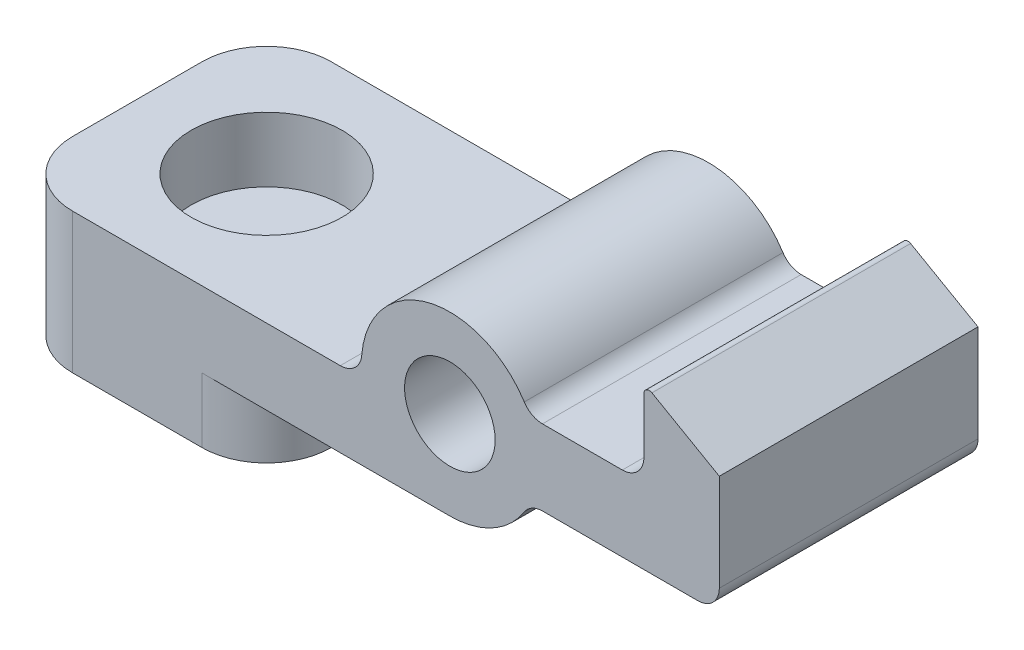
ISO-10303-21;
HEADER;
FILE_DESCRIPTION(('STEP AP214'),'2;1');
FILE_NAME('part.step','',(''),(''),'','','');
FILE_SCHEMA(('AUTOMOTIVE_DESIGN { 1 0 10303 214 1 1 1 1 }'));
ENDSEC;
DATA;
#1=APPLICATION_CONTEXT('core data for automotive mechanical design processes');
#2=APPLICATION_PROTOCOL_DEFINITION('international standard','automotive_design',2000,#1);
#3=PRODUCT_CONTEXT('',#1,'mechanical');
#4=PRODUCT('Part','Part','',(#3));
#5=PRODUCT_RELATED_PRODUCT_CATEGORY('part','',(#4));
#6=PRODUCT_DEFINITION_FORMATION('','',#4);
#7=PRODUCT_DEFINITION_CONTEXT('part definition',#1,'design');
#8=PRODUCT_DEFINITION('design','',#6,#7);
#9=PRODUCT_DEFINITION_SHAPE('','',#8);
#10=(LENGTH_UNIT() NAMED_UNIT(*) SI_UNIT(.MILLI.,.METRE.));
#11=(NAMED_UNIT(*) PLANE_ANGLE_UNIT() SI_UNIT($,.RADIAN.));
#12=(NAMED_UNIT(*) SI_UNIT($,.STERADIAN.) SOLID_ANGLE_UNIT());
#13=UNCERTAINTY_MEASURE_WITH_UNIT(LENGTH_MEASURE(1.E-05),#10,'distance_accuracy_value','');
#14=(GEOMETRIC_REPRESENTATION_CONTEXT(3) GLOBAL_UNCERTAINTY_ASSIGNED_CONTEXT((#13)) GLOBAL_UNIT_ASSIGNED_CONTEXT((#10,
#11,#12)) REPRESENTATION_CONTEXT('',''));
#15=CARTESIAN_POINT('',(0.,0.,0.));
#16=DIRECTION('',(0.,0.,1.));
#17=DIRECTION('',(1.,0.,0.));
#18=AXIS2_PLACEMENT_3D('',#15,#16,#17);
#19=CARTESIAN_POINT('',(0.,-4.1,12.));
#20=DIRECTION('',(0.,-1.,0.));
#21=DIRECTION('',(1.,0.,0.));
#22=AXIS2_PLACEMENT_3D('',#19,#20,#21);
#23=PLANE('',#22);
#24=DIRECTION('',(-1.,0.,0.));
#25=VECTOR('',#24,1.);
#26=CARTESIAN_POINT('',(0.,-4.1,12.));
#27=LINE('',#26,#25);
#28=CARTESIAN_POINT('',(0.,-4.1,12.));
#29=VERTEX_POINT('',#28);
#30=CARTESIAN_POINT('',(-11.5,-4.1,12.));
#31=VERTEX_POINT('',#30);
#32=EDGE_CURVE('E80',#29,#31,#27,.T.);
#33=ORIENTED_EDGE('',*,*,#32,.T.);
#34=CARTESIAN_POINT('',(-11.5,-4.1,9.));
#35=DIRECTION('',(0.,-1.,0.));
#36=DIRECTION('',(1.,0.,0.));
#37=AXIS2_PLACEMENT_3D('',#34,#35,#36);
#38=CIRCLE('',#37,3.);
#39=CARTESIAN_POINT('',(-8.5,-4.1,9.));
#40=VERTEX_POINT('',#39);
#41=EDGE_CURVE('E12',#31,#40,#38,.F.);
#42=ORIENTED_EDGE('',*,*,#41,.T.);
#43=DIRECTION('',(0.,0.,1.));
#44=VECTOR('',#43,1.);
#45=CARTESIAN_POINT('',(-8.5,-4.1,12.));
#46=LINE('',#45,#44);
#47=CARTESIAN_POINT('',(-8.5,-4.1,3.));
#48=VERTEX_POINT('',#47);
#49=EDGE_CURVE('E240',#48,#40,#46,.T.);
#50=ORIENTED_EDGE('',*,*,#49,.F.);
#51=CARTESIAN_POINT('',(-11.5,-4.1,3.));
#52=DIRECTION('',(0.,-1.,0.));
#53=DIRECTION('',(1.,0.,0.));
#54=AXIS2_PLACEMENT_3D('',#51,#52,#53);
#55=CIRCLE('',#54,3.);
#56=CARTESIAN_POINT('',(-11.5,-4.1,0.));
#57=VERTEX_POINT('',#56);
#58=EDGE_CURVE('E74',#48,#57,#55,.F.);
#59=ORIENTED_EDGE('',*,*,#58,.T.);
#60=DIRECTION('',(-1.,0.,0.));
#61=VECTOR('',#60,1.);
#62=CARTESIAN_POINT('',(0.,-4.1,0.));
#63=LINE('',#62,#61);
#64=CARTESIAN_POINT('',(0.,-4.1,0.));
#65=VERTEX_POINT('',#64);
#66=EDGE_CURVE('E273',#65,#57,#63,.T.);
#67=ORIENTED_EDGE('',*,*,#66,.F.);
#68=DIRECTION('',(0.,0.,-1.));
#69=VECTOR('',#68,1.);
#70=CARTESIAN_POINT('',(0.,-4.1,12.));
#71=LINE('',#70,#69);
#72=EDGE_CURVE('E309',#29,#65,#71,.T.);
#73=ORIENTED_EDGE('',*,*,#72,.F.);
#74=EDGE_LOOP('',(#33,#42,#50,#59,#67,#73));
#75=FACE_BOUND('',#74,.T.);
#76=ADVANCED_FACE('F66',(#75),#23,.T.);
#77=CARTESIAN_POINT('',(0.,0.,12.));
#78=DIRECTION('',(0.,0.,1.));
#79=DIRECTION('',(1.,0.,0.));
#80=AXIS2_PLACEMENT_3D('',#77,#78,#79);
#81=PLANE('',#80);
#82=DIRECTION('',(-1.,0.,0.));
#83=VECTOR('',#82,1.);
#84=CARTESIAN_POINT('',(-8.5,-7.1,12.));
#85=LINE('',#84,#83);
#86=CARTESIAN_POINT('',(-11.5,-7.1,12.));
#87=VERTEX_POINT('',#86);
#88=CARTESIAN_POINT('',(-17.5,-7.1,12.));
#89=VERTEX_POINT('',#88);
#90=EDGE_CURVE('E238',#87,#89,#85,.T.);
#91=ORIENTED_EDGE('',*,*,#90,.F.);
#92=DIRECTION('',(0.,1.,0.));
#93=VECTOR('',#92,1.);
#94=CARTESIAN_POINT('',(-11.5,-4.1,12.));
#95=LINE('',#94,#93);
#96=EDGE_CURVE('E388',#87,#31,#95,.T.);
#97=ORIENTED_EDGE('',*,*,#96,.T.);
#98=ORIENTED_EDGE('',*,*,#32,.F.);
#99=CARTESIAN_POINT('',(0.,0.,12.));
#100=DIRECTION('',(0.,0.,1.));
#101=DIRECTION('',(1.,0.,0.));
#102=AXIS2_PLACEMENT_3D('',#99,#100,#101);
#103=CIRCLE('',#102,4.1);
#104=CARTESIAN_POINT('',(3.45288759130461,-2.21078431372549,12.));
#105=VERTEX_POINT('',#104);
#106=EDGE_CURVE('E286',#29,#105,#103,.T.);
#107=ORIENTED_EDGE('',*,*,#106,.T.);
#108=CARTESIAN_POINT('',(4.29505529650085,-2.75,12.));
#109=DIRECTION('',(0.,0.,1.));
#110=DIRECTION('',(1.,0.,0.));
#111=AXIS2_PLACEMENT_3D('',#108,#109,#110);
#112=CIRCLE('',#111,1.);
#113=CARTESIAN_POINT('',(4.29505529650085,-1.75,12.));
#114=VERTEX_POINT('',#113);
#115=EDGE_CURVE('E354',#105,#114,#112,.F.);
#116=ORIENTED_EDGE('',*,*,#115,.T.);
#117=DIRECTION('',(-1.,0.,0.));
#118=VECTOR('',#117,1.);
#119=CARTESIAN_POINT('',(12.5,-1.75,12.));
#120=LINE('',#119,#118);
#121=CARTESIAN_POINT('',(11.5,-1.75,12.));
#122=VERTEX_POINT('',#121);
#123=EDGE_CURVE('E283',#122,#114,#120,.T.);
#124=ORIENTED_EDGE('',*,*,#123,.F.);
#125=CARTESIAN_POINT('',(11.5,-0.75,12.));
#126=DIRECTION('',(0.,0.,1.));
#127=DIRECTION('',(1.,0.,0.));
#128=AXIS2_PLACEMENT_3D('',#125,#126,#127);
#129=CIRCLE('',#128,1.);
#130=CARTESIAN_POINT('',(12.5,-0.75,12.));
#131=VERTEX_POINT('',#130);
#132=EDGE_CURVE('E330',#122,#131,#129,.T.);
#133=ORIENTED_EDGE('',*,*,#132,.T.);
#134=DIRECTION('',(0.,-1.,0.));
#135=VECTOR('',#134,1.);
#136=CARTESIAN_POINT('',(12.5,5.75,12.));
#137=LINE('',#136,#135);
#138=CARTESIAN_POINT('',(12.5,3.75,12.));
#139=VERTEX_POINT('',#138);
#140=EDGE_CURVE('E281',#139,#131,#137,.T.);
#141=ORIENTED_EDGE('',*,*,#140,.F.);
#142=DIRECTION('',(0.868243142124459,-0.496138938356834,0.));
#143=VECTOR('',#142,1.);
#144=CARTESIAN_POINT('',(12.5,3.75,12.));
#145=LINE('',#144,#143);
#146=CARTESIAN_POINT('',(9.37403473458921,5.53626586594902,12.));
#147=VERTEX_POINT('',#146);
#148=EDGE_CURVE('E254',#147,#139,#145,.T.);
#149=ORIENTED_EDGE('',*,*,#148,.F.);
#150=CARTESIAN_POINT('',(9.25,5.31920508041791,12.));
#151=DIRECTION('',(0.,0.,1.));
#152=DIRECTION('',(1.,0.,0.));
#153=AXIS2_PLACEMENT_3D('',#150,#151,#152);
#154=CIRCLE('',#153,0.25);
#155=CARTESIAN_POINT('',(9.,5.31920508041791,12.));
#156=VERTEX_POINT('',#155);
#157=EDGE_CURVE('E368',#147,#156,#154,.T.);
#158=ORIENTED_EDGE('',*,*,#157,.T.);
#159=DIRECTION('',(0.,-1.,0.));
#160=VECTOR('',#159,1.);
#161=CARTESIAN_POINT('',(9.,5.75,12.));
#162=LINE('',#161,#160);
#163=CARTESIAN_POINT('',(9.,2.75,12.));
#164=VERTEX_POINT('',#163);
#165=EDGE_CURVE('E279',#156,#164,#162,.T.);
#166=ORIENTED_EDGE('',*,*,#165,.T.);
#167=CARTESIAN_POINT('',(8.,2.75,12.));
#168=DIRECTION('',(0.,0.,1.));
#169=DIRECTION('',(1.,0.,0.));
#170=AXIS2_PLACEMENT_3D('',#167,#168,#169);
#171=CIRCLE('',#170,1.);
#172=CARTESIAN_POINT('',(8.,1.75,12.));
#173=VERTEX_POINT('',#172);
#174=EDGE_CURVE('E346',#164,#173,#171,.F.);
#175=ORIENTED_EDGE('',*,*,#174,.T.);
#176=DIRECTION('',(-1.,0.,0.));
#177=VECTOR('',#176,1.);
#178=CARTESIAN_POINT('',(9.,1.75,12.));
#179=LINE('',#178,#177);
#180=CARTESIAN_POINT('',(4.29505529650085,1.75,12.));
#181=VERTEX_POINT('',#180);
#182=EDGE_CURVE('E276',#173,#181,#179,.T.);
#183=ORIENTED_EDGE('',*,*,#182,.T.);
#184=CARTESIAN_POINT('',(4.29505529650085,2.75,12.));
#185=DIRECTION('',(0.,0.,1.));
#186=DIRECTION('',(1.,0.,0.));
#187=AXIS2_PLACEMENT_3D('',#184,#185,#186);
#188=CIRCLE('',#187,1.);
#189=CARTESIAN_POINT('',(3.45288759130461,2.21078431372549,12.));
#190=VERTEX_POINT('',#189);
#191=EDGE_CURVE('E350',#181,#190,#188,.F.);
#192=ORIENTED_EDGE('',*,*,#191,.T.);
#193=CARTESIAN_POINT('',(0.,0.,12.));
#194=DIRECTION('',(0.,0.,1.));
#195=DIRECTION('',(1.,0.,0.));
#196=AXIS2_PLACEMENT_3D('',#193,#194,#195);
#197=CIRCLE('',#196,4.1);
#198=CARTESIAN_POINT('',(-4.08737001234771,0.321568627450979,12.));
#199=VERTEX_POINT('',#198);
#200=EDGE_CURVE('E272',#190,#199,#197,.T.);
#201=ORIENTED_EDGE('',*,*,#200,.T.);
#202=CARTESIAN_POINT('',(-5.08428952755447,0.399999999999998,12.));
#203=DIRECTION('',(0.,0.,1.));
#204=DIRECTION('',(1.,0.,0.));
#205=AXIS2_PLACEMENT_3D('',#202,#203,#204);
#206=CIRCLE('',#205,1.);
#207=CARTESIAN_POINT('',(-5.08428952755447,-0.600000000000002,12.));
#208=VERTEX_POINT('',#207);
#209=EDGE_CURVE('E358',#199,#208,#206,.F.);
#210=ORIENTED_EDGE('',*,*,#209,.T.);
#211=DIRECTION('',(1.,0.,0.));
#212=VECTOR('',#211,1.);
#213=CARTESIAN_POINT('',(-20.5,-0.600000000000003,12.));
#214=LINE('',#213,#212);
#215=CARTESIAN_POINT('',(-17.5,-0.600000000000003,12.));
#216=VERTEX_POINT('',#215);
#217=EDGE_CURVE('E270',#216,#208,#214,.T.);
#218=ORIENTED_EDGE('',*,*,#217,.F.);
#219=DIRECTION('',(0.,1.,0.));
#220=VECTOR('',#219,1.);
#221=CARTESIAN_POINT('',(-17.5,0.,12.));
#222=LINE('',#221,#220);
#223=EDGE_CURVE('E373',#216,#89,#222,.F.);
#224=ORIENTED_EDGE('',*,*,#223,.T.);
#225=EDGE_LOOP('',(#91,#97,#98,#107,#116,#124,#133,#141,#149,#158,#166,#175,#183,#192,#201,#210,
#218,#224));
#226=FACE_BOUND('',#225,.T.);
#227=CARTESIAN_POINT('',(0.,0.,12.));
#228=DIRECTION('',(0.,0.,1.));
#229=DIRECTION('',(1.,0.,0.));
#230=AXIS2_PLACEMENT_3D('',#227,#228,#229);
#231=CIRCLE('',#230,2.1);
#232=CARTESIAN_POINT('',(2.1,0.,12.));
#233=VERTEX_POINT('',#232);
#234=EDGE_CURVE('E264',#233,#233,#231,.T.);
#235=ORIENTED_EDGE('',*,*,#234,.F.);
#236=EDGE_LOOP('',(#235));
#237=FACE_BOUND('',#236,.T.);
#238=ADVANCED_FACE('F449',(#226,#237),#81,.T.);
#239=CARTESIAN_POINT('',(0.,0.,0.));
#240=DIRECTION('',(0.,0.,1.));
#241=DIRECTION('',(1.,0.,0.));
#242=AXIS2_PLACEMENT_3D('',#239,#240,#241);
#243=PLANE('',#242);
#244=ORIENTED_EDGE('',*,*,#66,.T.);
#245=DIRECTION('',(0.,1.,0.));
#246=VECTOR('',#245,1.);
#247=CARTESIAN_POINT('',(-11.5,0.,0.));
#248=LINE('',#247,#246);
#249=CARTESIAN_POINT('',(-11.5,-7.1,0.));
#250=VERTEX_POINT('',#249);
#251=EDGE_CURVE('E383',#57,#250,#248,.F.);
#252=ORIENTED_EDGE('',*,*,#251,.T.);
#253=DIRECTION('',(1.,0.,0.));
#254=VECTOR('',#253,1.);
#255=CARTESIAN_POINT('',(-17.5,-7.1,0.));
#256=LINE('',#255,#254);
#257=CARTESIAN_POINT('',(-17.5,-7.1,0.));
#258=VERTEX_POINT('',#257);
#259=EDGE_CURVE('E250',#258,#250,#256,.T.);
#260=ORIENTED_EDGE('',*,*,#259,.F.);
#261=DIRECTION('',(0.,1.,0.));
#262=VECTOR('',#261,1.);
#263=CARTESIAN_POINT('',(-17.5,-0.600000000000003,0.));
#264=LINE('',#263,#262);
#265=CARTESIAN_POINT('',(-17.5,-0.600000000000003,0.));
#266=VERTEX_POINT('',#265);
#267=EDGE_CURVE('E375',#258,#266,#264,.T.);
#268=ORIENTED_EDGE('',*,*,#267,.T.);
#269=DIRECTION('',(1.,0.,0.));
#270=VECTOR('',#269,1.);
#271=CARTESIAN_POINT('',(-20.5,-0.600000000000003,0.));
#272=LINE('',#271,#270);
#273=CARTESIAN_POINT('',(-5.08428952755447,-0.600000000000002,0.));
#274=VERTEX_POINT('',#273);
#275=EDGE_CURVE('E267',#266,#274,#272,.T.);
#276=ORIENTED_EDGE('',*,*,#275,.T.);
#277=CARTESIAN_POINT('',(-5.08428952755447,0.399999999999998,0.));
#278=DIRECTION('',(0.,0.,1.));
#279=DIRECTION('',(1.,0.,0.));
#280=AXIS2_PLACEMENT_3D('',#277,#278,#279);
#281=CIRCLE('',#280,1.);
#282=CARTESIAN_POINT('',(-4.08737001234771,0.321568627450979,0.));
#283=VERTEX_POINT('',#282);
#284=EDGE_CURVE('E356',#274,#283,#281,.T.);
#285=ORIENTED_EDGE('',*,*,#284,.T.);
#286=CARTESIAN_POINT('',(0.,0.,0.));
#287=DIRECTION('',(0.,0.,1.));
#288=DIRECTION('',(1.,0.,0.));
#289=AXIS2_PLACEMENT_3D('',#286,#287,#288);
#290=CIRCLE('',#289,4.1);
#291=CARTESIAN_POINT('',(3.45288759130461,2.21078431372549,0.));
#292=VERTEX_POINT('',#291);
#293=EDGE_CURVE('E292',#292,#283,#290,.T.);
#294=ORIENTED_EDGE('',*,*,#293,.F.);
#295=CARTESIAN_POINT('',(4.29505529650085,2.75,0.));
#296=DIRECTION('',(0.,0.,1.));
#297=DIRECTION('',(1.,0.,0.));
#298=AXIS2_PLACEMENT_3D('',#295,#296,#297);
#299=CIRCLE('',#298,1.);
#300=CARTESIAN_POINT('',(4.29505529650085,1.75,0.));
#301=VERTEX_POINT('',#300);
#302=EDGE_CURVE('E348',#292,#301,#299,.T.);
#303=ORIENTED_EDGE('',*,*,#302,.T.);
#304=DIRECTION('',(-1.,0.,0.));
#305=VECTOR('',#304,1.);
#306=CARTESIAN_POINT('',(9.,1.75,0.));
#307=LINE('',#306,#305);
#308=CARTESIAN_POINT('',(8.,1.75,0.));
#309=VERTEX_POINT('',#308);
#310=EDGE_CURVE('E295',#309,#301,#307,.T.);
#311=ORIENTED_EDGE('',*,*,#310,.F.);
#312=CARTESIAN_POINT('',(8.,2.75,0.));
#313=DIRECTION('',(0.,0.,1.));
#314=DIRECTION('',(1.,0.,0.));
#315=AXIS2_PLACEMENT_3D('',#312,#313,#314);
#316=CIRCLE('',#315,1.);
#317=CARTESIAN_POINT('',(9.,2.75,0.));
#318=VERTEX_POINT('',#317);
#319=EDGE_CURVE('E343',#309,#318,#316,.T.);
#320=ORIENTED_EDGE('',*,*,#319,.T.);
#321=DIRECTION('',(0.,-1.,0.));
#322=VECTOR('',#321,1.);
#323=CARTESIAN_POINT('',(9.,5.75,0.));
#324=LINE('',#323,#322);
#325=CARTESIAN_POINT('',(9.,5.31920508041791,0.));
#326=VERTEX_POINT('',#325);
#327=EDGE_CURVE('E298',#326,#318,#324,.T.);
#328=ORIENTED_EDGE('',*,*,#327,.F.);
#329=CARTESIAN_POINT('',(9.25,5.31920508041791,0.));
#330=DIRECTION('',(0.,0.,1.));
#331=DIRECTION('',(1.,0.,0.));
#332=AXIS2_PLACEMENT_3D('',#329,#330,#331);
#333=CIRCLE('',#332,0.25);
#334=CARTESIAN_POINT('',(9.37403473458921,5.53626586594902,0.));
#335=VERTEX_POINT('',#334);
#336=EDGE_CURVE('E364',#326,#335,#333,.F.);
#337=ORIENTED_EDGE('',*,*,#336,.T.);
#338=DIRECTION('',(-0.868243142124459,0.496138938356834,0.));
#339=VECTOR('',#338,1.);
#340=CARTESIAN_POINT('',(12.5,3.75,0.));
#341=LINE('',#340,#339);
#342=CARTESIAN_POINT('',(12.5,3.75,0.));
#343=VERTEX_POINT('',#342);
#344=EDGE_CURVE('E256',#343,#335,#341,.T.);
#345=ORIENTED_EDGE('',*,*,#344,.F.);
#346=DIRECTION('',(0.,-1.,0.));
#347=VECTOR('',#346,1.);
#348=CARTESIAN_POINT('',(12.5,5.75,0.));
#349=LINE('',#348,#347);
#350=CARTESIAN_POINT('',(12.5,-0.75,0.));
#351=VERTEX_POINT('',#350);
#352=EDGE_CURVE('E300',#343,#351,#349,.T.);
#353=ORIENTED_EDGE('',*,*,#352,.T.);
#354=CARTESIAN_POINT('',(11.5,-0.75,0.));
#355=DIRECTION('',(0.,0.,1.));
#356=DIRECTION('',(1.,0.,0.));
#357=AXIS2_PLACEMENT_3D('',#354,#355,#356);
#358=CIRCLE('',#357,1.);
#359=CARTESIAN_POINT('',(11.5,-1.75,0.));
#360=VERTEX_POINT('',#359);
#361=EDGE_CURVE('E323',#351,#360,#358,.F.);
#362=ORIENTED_EDGE('',*,*,#361,.T.);
#363=DIRECTION('',(-1.,0.,0.));
#364=VECTOR('',#363,1.);
#365=CARTESIAN_POINT('',(12.5,-1.75,0.));
#366=LINE('',#365,#364);
#367=CARTESIAN_POINT('',(4.29505529650085,-1.75,0.));
#368=VERTEX_POINT('',#367);
#369=EDGE_CURVE('E302',#360,#368,#366,.T.);
#370=ORIENTED_EDGE('',*,*,#369,.T.);
#371=CARTESIAN_POINT('',(4.29505529650085,-2.75,0.));
#372=DIRECTION('',(0.,0.,1.));
#373=DIRECTION('',(1.,0.,0.));
#374=AXIS2_PLACEMENT_3D('',#371,#372,#373);
#375=CIRCLE('',#374,1.);
#376=CARTESIAN_POINT('',(3.45288759130461,-2.21078431372549,0.));
#377=VERTEX_POINT('',#376);
#378=EDGE_CURVE('E352',#368,#377,#375,.T.);
#379=ORIENTED_EDGE('',*,*,#378,.T.);
#380=CARTESIAN_POINT('',(0.,0.,0.));
#381=DIRECTION('',(0.,0.,1.));
#382=DIRECTION('',(1.,0.,0.));
#383=AXIS2_PLACEMENT_3D('',#380,#381,#382);
#384=CIRCLE('',#383,4.1);
#385=EDGE_CURVE('E305',#65,#377,#384,.T.);
#386=ORIENTED_EDGE('',*,*,#385,.F.);
#387=EDGE_LOOP('',(#244,#252,#260,#268,#276,#285,#294,#303,#311,#320,#328,#337,#345,#353,#362,
#370,#379,#386));
#388=FACE_BOUND('',#387,.T.);
#389=CARTESIAN_POINT('',(0.,0.,0.));
#390=DIRECTION('',(0.,0.,1.));
#391=DIRECTION('',(1.,0.,0.));
#392=AXIS2_PLACEMENT_3D('',#389,#390,#391);
#393=CIRCLE('',#392,2.1);
#394=CARTESIAN_POINT('',(2.1,0.,0.));
#395=VERTEX_POINT('',#394);
#396=EDGE_CURVE('E259',#395,#395,#393,.T.);
#397=ORIENTED_EDGE('',*,*,#396,.T.);
#398=EDGE_LOOP('',(#397));
#399=FACE_BOUND('',#398,.T.);
#400=ADVANCED_FACE('F400',(#388,#399),#243,.F.);
#401=CARTESIAN_POINT('',(-20.5,-4.1,12.));
#402=DIRECTION('',(-1.,0.,0.));
#403=DIRECTION('',(0.,0.,1.));
#404=AXIS2_PLACEMENT_3D('',#401,#402,#403);
#405=PLANE('',#404);
#406=DIRECTION('',(0.,1.,0.));
#407=VECTOR('',#406,1.);
#408=CARTESIAN_POINT('',(-20.5,-4.1,3.));
#409=LINE('',#408,#407);
#410=CARTESIAN_POINT('',(-20.5,-0.600000000000003,3.));
#411=VERTEX_POINT('',#410);
#412=CARTESIAN_POINT('',(-20.5,-7.1,3.));
#413=VERTEX_POINT('',#412);
#414=EDGE_CURVE('E226',#411,#413,#409,.F.);
#415=ORIENTED_EDGE('',*,*,#414,.T.);
#416=DIRECTION('',(0.,0.,-1.));
#417=VECTOR('',#416,1.);
#418=CARTESIAN_POINT('',(-20.5,-7.1,9.));
#419=LINE('',#418,#417);
#420=CARTESIAN_POINT('',(-20.5,-7.1,9.));
#421=VERTEX_POINT('',#420);
#422=EDGE_CURVE('E229',#421,#413,#419,.T.);
#423=ORIENTED_EDGE('',*,*,#422,.F.);
#424=DIRECTION('',(0.,1.,0.));
#425=VECTOR('',#424,1.);
#426=CARTESIAN_POINT('',(-20.5,-4.1,9.));
#427=LINE('',#426,#425);
#428=CARTESIAN_POINT('',(-20.5,-0.600000000000003,9.));
#429=VERTEX_POINT('',#428);
#430=EDGE_CURVE('E215',#421,#429,#427,.T.);
#431=ORIENTED_EDGE('',*,*,#430,.T.);
#432=DIRECTION('',(0.,0.,-1.));
#433=VECTOR('',#432,1.);
#434=CARTESIAN_POINT('',(-20.5,-0.600000000000003,12.));
#435=LINE('',#434,#433);
#436=EDGE_CURVE('E290',#429,#411,#435,.T.);
#437=ORIENTED_EDGE('',*,*,#436,.T.);
#438=EDGE_LOOP('',(#415,#423,#431,#437));
#439=FACE_BOUND('',#438,.T.);
#440=ADVANCED_FACE('F230',(#439),#405,.T.);
#441=CARTESIAN_POINT('',(0.,0.,12.));
#442=DIRECTION('',(0.,0.,-1.));
#443=DIRECTION('',(-1.,0.,0.));
#444=AXIS2_PLACEMENT_3D('',#441,#442,#443);
#445=CYLINDRICAL_SURFACE('',#444,4.1);
#446=ORIENTED_EDGE('',*,*,#385,.T.);
#447=DIRECTION('',(0.,0.,-1.));
#448=VECTOR('',#447,1.);
#449=CARTESIAN_POINT('',(3.45288759130461,-2.21078431372549,12.));
#450=LINE('',#449,#448);
#451=EDGE_CURVE('E338',#377,#105,#450,.F.);
#452=ORIENTED_EDGE('',*,*,#451,.T.);
#453=ORIENTED_EDGE('',*,*,#106,.F.);
#454=ORIENTED_EDGE('',*,*,#72,.T.);
#455=EDGE_LOOP('',(#446,#452,#453,#454));
#456=FACE_BOUND('',#455,.T.);
#457=ADVANCED_FACE('F471',(#456),#445,.T.);
#458=CARTESIAN_POINT('',(12.5,-1.75,12.));
#459=DIRECTION('',(0.,-1.,0.));
#460=DIRECTION('',(1.,0.,0.));
#461=AXIS2_PLACEMENT_3D('',#458,#459,#460);
#462=PLANE('',#461);
#463=ORIENTED_EDGE('',*,*,#369,.F.);
#464=DIRECTION('',(0.,0.,-1.));
#465=VECTOR('',#464,1.);
#466=CARTESIAN_POINT('',(11.5,-1.75,12.));
#467=LINE('',#466,#465);
#468=EDGE_CURVE('E328',#360,#122,#467,.F.);
#469=ORIENTED_EDGE('',*,*,#468,.T.);
#470=ORIENTED_EDGE('',*,*,#123,.T.);
#471=DIRECTION('',(0.,0.,-1.));
#472=VECTOR('',#471,1.);
#473=CARTESIAN_POINT('',(4.29505529650085,-1.75,12.));
#474=LINE('',#473,#472);
#475=EDGE_CURVE('E325',#114,#368,#474,.T.);
#476=ORIENTED_EDGE('',*,*,#475,.T.);
#477=EDGE_LOOP('',(#463,#469,#470,#476));
#478=FACE_BOUND('',#477,.T.);
#479=ADVANCED_FACE('F463',(#478),#462,.T.);
#480=CARTESIAN_POINT('',(12.5,5.75,12.));
#481=DIRECTION('',(1.,0.,0.));
#482=DIRECTION('',(0.,0.,-1.));
#483=AXIS2_PLACEMENT_3D('',#480,#481,#482);
#484=PLANE('',#483);
#485=DIRECTION('',(0.,0.,1.));
#486=VECTOR('',#485,1.);
#487=CARTESIAN_POINT('',(12.5,3.75,-4.03112887414928));
#488=LINE('',#487,#486);
#489=EDGE_CURVE('E260',#343,#139,#488,.T.);
#490=ORIENTED_EDGE('',*,*,#489,.T.);
#491=ORIENTED_EDGE('',*,*,#140,.T.);
#492=DIRECTION('',(0.,0.,-1.));
#493=VECTOR('',#492,1.);
#494=CARTESIAN_POINT('',(12.5,-0.75,12.));
#495=LINE('',#494,#493);
#496=EDGE_CURVE('E320',#131,#351,#495,.T.);
#497=ORIENTED_EDGE('',*,*,#496,.T.);
#498=ORIENTED_EDGE('',*,*,#352,.F.);
#499=EDGE_LOOP('',(#490,#491,#497,#498));
#500=FACE_BOUND('',#499,.T.);
#501=ADVANCED_FACE('F455',(#500),#484,.T.);
#502=CARTESIAN_POINT('',(9.,5.75,12.));
#503=DIRECTION('',(1.,0.,0.));
#504=DIRECTION('',(0.,0.,-1.));
#505=AXIS2_PLACEMENT_3D('',#502,#503,#504);
#506=PLANE('',#505);
#507=ORIENTED_EDGE('',*,*,#165,.F.);
#508=DIRECTION('',(0.,0.,-1.));
#509=VECTOR('',#508,1.);
#510=CARTESIAN_POINT('',(9.,5.31920508041791,12.));
#511=LINE('',#510,#509);
#512=EDGE_CURVE('E361',#156,#326,#511,.T.);
#513=ORIENTED_EDGE('',*,*,#512,.T.);
#514=ORIENTED_EDGE('',*,*,#327,.T.);
#515=DIRECTION('',(0.,0.,-1.));
#516=VECTOR('',#515,1.);
#517=CARTESIAN_POINT('',(9.,2.75,12.));
#518=LINE('',#517,#516);
#519=EDGE_CURVE('E317',#318,#164,#518,.F.);
#520=ORIENTED_EDGE('',*,*,#519,.T.);
#521=EDGE_LOOP('',(#507,#513,#514,#520));
#522=FACE_BOUND('',#521,.T.);
#523=ADVANCED_FACE('F438',(#522),#506,.F.);
#524=CARTESIAN_POINT('',(9.,1.75,12.));
#525=DIRECTION('',(0.,-1.,0.));
#526=DIRECTION('',(1.,0.,0.));
#527=AXIS2_PLACEMENT_3D('',#524,#525,#526);
#528=PLANE('',#527);
#529=ORIENTED_EDGE('',*,*,#182,.F.);
#530=DIRECTION('',(0.,0.,-1.));
#531=VECTOR('',#530,1.);
#532=CARTESIAN_POINT('',(8.,1.75,0.));
#533=LINE('',#532,#531);
#534=EDGE_CURVE('E314',#173,#309,#533,.T.);
#535=ORIENTED_EDGE('',*,*,#534,.T.);
#536=ORIENTED_EDGE('',*,*,#310,.T.);
#537=DIRECTION('',(0.,0.,1.));
#538=VECTOR('',#537,1.);
#539=CARTESIAN_POINT('',(4.29505529650085,1.75,12.));
#540=LINE('',#539,#538);
#541=EDGE_CURVE('E311',#301,#181,#540,.T.);
#542=ORIENTED_EDGE('',*,*,#541,.T.);
#543=EDGE_LOOP('',(#529,#535,#536,#542));
#544=FACE_BOUND('',#543,.T.);
#545=ADVANCED_FACE('F428',(#544),#528,.F.);
#546=CARTESIAN_POINT('',(0.,0.,12.));
#547=DIRECTION('',(0.,0.,-1.));
#548=DIRECTION('',(-1.,0.,0.));
#549=AXIS2_PLACEMENT_3D('',#546,#547,#548);
#550=CYLINDRICAL_SURFACE('',#549,4.1);
#551=ORIENTED_EDGE('',*,*,#200,.F.);
#552=DIRECTION('',(0.,0.,-1.));
#553=VECTOR('',#552,1.);
#554=CARTESIAN_POINT('',(3.45288759130461,2.21078431372549,12.));
#555=LINE('',#554,#553);
#556=EDGE_CURVE('E335',#190,#292,#555,.T.);
#557=ORIENTED_EDGE('',*,*,#556,.T.);
#558=ORIENTED_EDGE('',*,*,#293,.T.);
#559=DIRECTION('',(0.,0.,-1.));
#560=VECTOR('',#559,1.);
#561=CARTESIAN_POINT('',(-4.08737001234771,0.321568627450979,12.));
#562=LINE('',#561,#560);
#563=EDGE_CURVE('E333',#283,#199,#562,.F.);
#564=ORIENTED_EDGE('',*,*,#563,.T.);
#565=EDGE_LOOP('',(#551,#557,#558,#564));
#566=FACE_BOUND('',#565,.T.);
#567=ADVANCED_FACE('F419',(#566),#550,.T.);
#568=CARTESIAN_POINT('',(-20.5,-0.600000000000003,12.));
#569=DIRECTION('',(0.,1.,0.));
#570=DIRECTION('',(-1.,0.,0.));
#571=AXIS2_PLACEMENT_3D('',#568,#569,#570);
#572=PLANE('',#571);
#573=CARTESIAN_POINT('',(-14.5,-0.600000000000003,6.));
#574=DIRECTION('',(0.,1.,0.));
#575=DIRECTION('',(-1.,0.,0.));
#576=AXIS2_PLACEMENT_3D('',#573,#574,#575);
#577=CIRCLE('',#576,3.5);
#578=CARTESIAN_POINT('',(-18.,-0.600000000000003,6.));
#579=VERTEX_POINT('',#578);
#580=EDGE_CURVE('E246',#579,#579,#577,.T.);
#581=ORIENTED_EDGE('',*,*,#580,.F.);
#582=EDGE_LOOP('',(#581));
#583=FACE_BOUND('',#582,.T.);
#584=ORIENTED_EDGE('',*,*,#436,.F.);
#585=CARTESIAN_POINT('',(-17.5,-0.600000000000003,9.));
#586=DIRECTION('',(0.,1.,0.));
#587=DIRECTION('',(-1.,0.,0.));
#588=AXIS2_PLACEMENT_3D('',#585,#586,#587);
#589=CIRCLE('',#588,3.);
#590=EDGE_CURVE('E221',#429,#216,#589,.T.);
#591=ORIENTED_EDGE('',*,*,#590,.T.);
#592=ORIENTED_EDGE('',*,*,#217,.T.);
#593=DIRECTION('',(0.,0.,-1.));
#594=VECTOR('',#593,1.);
#595=CARTESIAN_POINT('',(-5.08428952755447,-0.600000000000002,12.));
#596=LINE('',#595,#594);
#597=EDGE_CURVE('E340',#208,#274,#596,.T.);
#598=ORIENTED_EDGE('',*,*,#597,.T.);
#599=ORIENTED_EDGE('',*,*,#275,.F.);
#600=CARTESIAN_POINT('',(-17.5,-0.600000000000003,3.));
#601=DIRECTION('',(0.,1.,0.));
#602=DIRECTION('',(-1.,0.,0.));
#603=AXIS2_PLACEMENT_3D('',#600,#601,#602);
#604=CIRCLE('',#603,3.);
#605=EDGE_CURVE('E225',#266,#411,#604,.T.);
#606=ORIENTED_EDGE('',*,*,#605,.T.);
#607=EDGE_LOOP('',(#584,#591,#592,#598,#599,#606));
#608=FACE_BOUND('',#607,.T.);
#609=ADVANCED_FACE('F409',(#583,#608),#572,.T.);
#610=CARTESIAN_POINT('',(0.,0.,12.));
#611=DIRECTION('',(0.,0.,-1.));
#612=DIRECTION('',(-1.,0.,0.));
#613=AXIS2_PLACEMENT_3D('',#610,#611,#612);
#614=CYLINDRICAL_SURFACE('',#613,2.1);
#615=ORIENTED_EDGE('',*,*,#234,.T.);
#616=EDGE_LOOP('',(#615));
#617=FACE_BOUND('',#616,.T.);
#618=ORIENTED_EDGE('',*,*,#396,.F.);
#619=EDGE_LOOP('',(#618));
#620=FACE_BOUND('',#619,.T.);
#621=ADVANCED_FACE('F508',(#617,#620),#614,.F.);
#622=CARTESIAN_POINT('',(8.,2.75,12.));
#623=DIRECTION('',(0.,0.,1.));
#624=DIRECTION('',(1.,0.,0.));
#625=AXIS2_PLACEMENT_3D('',#622,#623,#624);
#626=CYLINDRICAL_SURFACE('',#625,1.);
#627=ORIENTED_EDGE('',*,*,#174,.F.);
#628=ORIENTED_EDGE('',*,*,#519,.F.);
#629=ORIENTED_EDGE('',*,*,#319,.F.);
#630=ORIENTED_EDGE('',*,*,#534,.F.);
#631=EDGE_LOOP('',(#627,#628,#629,#630));
#632=FACE_BOUND('',#631,.T.);
#633=ADVANCED_FACE('F432',(#632),#626,.F.);
#634=CARTESIAN_POINT('',(11.5,-0.75,12.));
#635=DIRECTION('',(0.,0.,-1.));
#636=DIRECTION('',(-1.,0.,0.));
#637=AXIS2_PLACEMENT_3D('',#634,#635,#636);
#638=CYLINDRICAL_SURFACE('',#637,1.);
#639=ORIENTED_EDGE('',*,*,#132,.F.);
#640=ORIENTED_EDGE('',*,*,#468,.F.);
#641=ORIENTED_EDGE('',*,*,#361,.F.);
#642=ORIENTED_EDGE('',*,*,#496,.F.);
#643=EDGE_LOOP('',(#639,#640,#641,#642));
#644=FACE_BOUND('',#643,.T.);
#645=ADVANCED_FACE('F461',(#644),#638,.T.);
#646=CARTESIAN_POINT('',(4.29505529650085,2.75,12.));
#647=DIRECTION('',(0.,0.,-1.));
#648=DIRECTION('',(-1.,0.,0.));
#649=AXIS2_PLACEMENT_3D('',#646,#647,#648);
#650=CYLINDRICAL_SURFACE('',#649,1.);
#651=ORIENTED_EDGE('',*,*,#191,.F.);
#652=ORIENTED_EDGE('',*,*,#541,.F.);
#653=ORIENTED_EDGE('',*,*,#302,.F.);
#654=ORIENTED_EDGE('',*,*,#556,.F.);
#655=EDGE_LOOP('',(#651,#652,#653,#654));
#656=FACE_BOUND('',#655,.T.);
#657=ADVANCED_FACE('F423',(#656),#650,.F.);
#658=CARTESIAN_POINT('',(4.29505529650085,-2.75,12.));
#659=DIRECTION('',(0.,0.,-1.));
#660=DIRECTION('',(-1.,0.,0.));
#661=AXIS2_PLACEMENT_3D('',#658,#659,#660);
#662=CYLINDRICAL_SURFACE('',#661,1.);
#663=ORIENTED_EDGE('',*,*,#115,.F.);
#664=ORIENTED_EDGE('',*,*,#451,.F.);
#665=ORIENTED_EDGE('',*,*,#378,.F.);
#666=ORIENTED_EDGE('',*,*,#475,.F.);
#667=EDGE_LOOP('',(#663,#664,#665,#666));
#668=FACE_BOUND('',#667,.T.);
#669=ADVANCED_FACE('F469',(#668),#662,.F.);
#670=CARTESIAN_POINT('',(-5.08428952755447,0.399999999999998,12.));
#671=DIRECTION('',(0.,0.,-1.));
#672=DIRECTION('',(-1.,0.,0.));
#673=AXIS2_PLACEMENT_3D('',#670,#671,#672);
#674=CYLINDRICAL_SURFACE('',#673,1.);
#675=ORIENTED_EDGE('',*,*,#209,.F.);
#676=ORIENTED_EDGE('',*,*,#563,.F.);
#677=ORIENTED_EDGE('',*,*,#284,.F.);
#678=ORIENTED_EDGE('',*,*,#597,.F.);
#679=EDGE_LOOP('',(#675,#676,#677,#678));
#680=FACE_BOUND('',#679,.T.);
#681=ADVANCED_FACE('F414',(#680),#674,.F.);
#682=CARTESIAN_POINT('',(12.5,3.75,-4.03112887414928));
#683=DIRECTION('',(-0.496138938356834,-0.868243142124459,0.));
#684=DIRECTION('',(0.868243142124459,-0.496138938356834,0.));
#685=AXIS2_PLACEMENT_3D('',#682,#683,#684);
#686=PLANE('',#685);
#687=ORIENTED_EDGE('',*,*,#344,.T.);
#688=DIRECTION('',(0.,0.,-1.));
#689=VECTOR('',#688,1.);
#690=CARTESIAN_POINT('',(9.37403473458921,5.53626586594902,-4.03112887414928));
#691=LINE('',#690,#689);
#692=EDGE_CURVE('E366',#335,#147,#691,.F.);
#693=ORIENTED_EDGE('',*,*,#692,.T.);
#694=ORIENTED_EDGE('',*,*,#148,.T.);
#695=ORIENTED_EDGE('',*,*,#489,.F.);
#696=EDGE_LOOP('',(#687,#693,#694,#695));
#697=FACE_BOUND('',#696,.T.);
#698=ADVANCED_FACE('F446',(#697),#686,.F.);
#699=CARTESIAN_POINT('',(9.25,5.31920508041791,12.));
#700=DIRECTION('',(0.,0.,-1.));
#701=DIRECTION('',(-1.,0.,0.));
#702=AXIS2_PLACEMENT_3D('',#699,#700,#701);
#703=CYLINDRICAL_SURFACE('',#702,0.25);
#704=ORIENTED_EDGE('',*,*,#157,.F.);
#705=ORIENTED_EDGE('',*,*,#692,.F.);
#706=ORIENTED_EDGE('',*,*,#336,.F.);
#707=ORIENTED_EDGE('',*,*,#512,.F.);
#708=EDGE_LOOP('',(#704,#705,#706,#707));
#709=FACE_BOUND('',#708,.T.);
#710=ADVANCED_FACE('F442',(#709),#703,.T.);
#711=CARTESIAN_POINT('',(-17.5,-4.1,9.));
#712=DIRECTION('',(0.,1.,0.));
#713=DIRECTION('',(0.,0.,1.));
#714=AXIS2_PLACEMENT_3D('',#711,#712,#713);
#715=CYLINDRICAL_SURFACE('',#714,3.);
#716=ORIENTED_EDGE('',*,*,#430,.F.);
#717=CARTESIAN_POINT('',(-17.5,-7.1,9.));
#718=DIRECTION('',(0.,-1.,0.));
#719=DIRECTION('',(1.,0.,0.));
#720=AXIS2_PLACEMENT_3D('',#717,#718,#719);
#721=CIRCLE('',#720,3.);
#722=EDGE_CURVE('E220',#89,#421,#721,.T.);
#723=ORIENTED_EDGE('',*,*,#722,.F.);
#724=ORIENTED_EDGE('',*,*,#223,.F.);
#725=ORIENTED_EDGE('',*,*,#590,.F.);
#726=EDGE_LOOP('',(#716,#723,#724,#725));
#727=FACE_BOUND('',#726,.T.);
#728=ADVANCED_FACE('F217',(#727),#715,.T.);
#729=CARTESIAN_POINT('',(-17.5,0.,3.));
#730=DIRECTION('',(0.,-1.,0.));
#731=DIRECTION('',(0.,0.,-1.));
#732=AXIS2_PLACEMENT_3D('',#729,#730,#731);
#733=CYLINDRICAL_SURFACE('',#732,3.);
#734=ORIENTED_EDGE('',*,*,#267,.F.);
#735=CARTESIAN_POINT('',(-17.5,-7.1,3.));
#736=DIRECTION('',(0.,-1.,0.));
#737=DIRECTION('',(1.,0.,0.));
#738=AXIS2_PLACEMENT_3D('',#735,#736,#737);
#739=CIRCLE('',#738,3.);
#740=EDGE_CURVE('E234',#413,#258,#739,.T.);
#741=ORIENTED_EDGE('',*,*,#740,.F.);
#742=ORIENTED_EDGE('',*,*,#414,.F.);
#743=ORIENTED_EDGE('',*,*,#605,.F.);
#744=EDGE_LOOP('',(#734,#741,#742,#743));
#745=FACE_BOUND('',#744,.T.);
#746=ADVANCED_FACE('F405',(#745),#733,.T.);
#747=CARTESIAN_POINT('',(-8.5,-7.1,12.));
#748=DIRECTION('',(-1.,0.,0.));
#749=DIRECTION('',(0.,0.,1.));
#750=AXIS2_PLACEMENT_3D('',#747,#748,#749);
#751=PLANE('',#750);
#752=DIRECTION('',(0.,0.,1.));
#753=VECTOR('',#752,1.);
#754=CARTESIAN_POINT('',(-8.5,-7.1,12.));
#755=LINE('',#754,#753);
#756=CARTESIAN_POINT('',(-8.5,-7.1,3.));
#757=VERTEX_POINT('',#756);
#758=CARTESIAN_POINT('',(-8.5,-7.1,9.));
#759=VERTEX_POINT('',#758);
#760=EDGE_CURVE('E252',#757,#759,#755,.T.);
#761=ORIENTED_EDGE('',*,*,#760,.F.);
#762=DIRECTION('',(0.,1.,0.));
#763=VECTOR('',#762,1.);
#764=CARTESIAN_POINT('',(-8.5,-7.1,3.));
#765=LINE('',#764,#763);
#766=EDGE_CURVE('E380',#757,#48,#765,.T.);
#767=ORIENTED_EDGE('',*,*,#766,.T.);
#768=ORIENTED_EDGE('',*,*,#49,.T.);
#769=DIRECTION('',(0.,1.,0.));
#770=VECTOR('',#769,1.);
#771=CARTESIAN_POINT('',(-8.5,-7.1,9.));
#772=LINE('',#771,#770);
#773=EDGE_CURVE('E378',#40,#759,#772,.F.);
#774=ORIENTED_EDGE('',*,*,#773,.T.);
#775=EDGE_LOOP('',(#761,#767,#768,#774));
#776=FACE_BOUND('',#775,.T.);
#777=ADVANCED_FACE('F476',(#776),#751,.F.);
#778=CARTESIAN_POINT('',(-17.5,-7.1,9.));
#779=DIRECTION('',(0.,-1.,0.));
#780=DIRECTION('',(1.,0.,0.));
#781=AXIS2_PLACEMENT_3D('',#778,#779,#780);
#782=PLANE('',#781);
#783=ORIENTED_EDGE('',*,*,#259,.T.);
#784=CARTESIAN_POINT('',(-11.5,-7.1,3.));
#785=DIRECTION('',(0.,-1.,0.));
#786=DIRECTION('',(1.,0.,0.));
#787=AXIS2_PLACEMENT_3D('',#784,#785,#786);
#788=CIRCLE('',#787,3.);
#789=EDGE_CURVE('E386',#250,#757,#788,.T.);
#790=ORIENTED_EDGE('',*,*,#789,.T.);
#791=ORIENTED_EDGE('',*,*,#760,.T.);
#792=CARTESIAN_POINT('',(-11.5,-7.1,9.));
#793=DIRECTION('',(0.,-1.,0.));
#794=DIRECTION('',(1.,0.,0.));
#795=AXIS2_PLACEMENT_3D('',#792,#793,#794);
#796=CIRCLE('',#795,3.);
#797=EDGE_CURVE('E88',#759,#87,#796,.T.);
#798=ORIENTED_EDGE('',*,*,#797,.T.);
#799=ORIENTED_EDGE('',*,*,#90,.T.);
#800=ORIENTED_EDGE('',*,*,#722,.T.);
#801=ORIENTED_EDGE('',*,*,#422,.T.);
#802=ORIENTED_EDGE('',*,*,#740,.T.);
#803=EDGE_LOOP('',(#783,#790,#791,#798,#799,#800,#801,#802));
#804=FACE_BOUND('',#803,.T.);
#805=ADVANCED_FACE('F237',(#804),#782,.T.);
#806=CARTESIAN_POINT('',(-11.5,-7.1,3.));
#807=DIRECTION('',(0.,1.,0.));
#808=DIRECTION('',(-1.,0.,0.));
#809=AXIS2_PLACEMENT_3D('',#806,#807,#808);
#810=CYLINDRICAL_SURFACE('',#809,3.);
#811=ORIENTED_EDGE('',*,*,#789,.F.);
#812=ORIENTED_EDGE('',*,*,#251,.F.);
#813=ORIENTED_EDGE('',*,*,#58,.F.);
#814=ORIENTED_EDGE('',*,*,#766,.F.);
#815=EDGE_LOOP('',(#811,#812,#813,#814));
#816=FACE_BOUND('',#815,.T.);
#817=ADVANCED_FACE('F397',(#816),#810,.T.);
#818=CARTESIAN_POINT('',(-11.5,0.,9.));
#819=DIRECTION('',(0.,-1.,0.));
#820=DIRECTION('',(1.,0.,0.));
#821=AXIS2_PLACEMENT_3D('',#818,#819,#820);
#822=CYLINDRICAL_SURFACE('',#821,3.);
#823=ORIENTED_EDGE('',*,*,#797,.F.);
#824=ORIENTED_EDGE('',*,*,#773,.F.);
#825=ORIENTED_EDGE('',*,*,#41,.F.);
#826=ORIENTED_EDGE('',*,*,#96,.F.);
#827=EDGE_LOOP('',(#823,#824,#825,#826));
#828=FACE_BOUND('',#827,.T.);
#829=ADVANCED_FACE('F68',(#828),#822,.T.);
#830=CARTESIAN_POINT('',(-14.5,-3.6,6.));
#831=DIRECTION('',(0.,1.,0.));
#832=DIRECTION('',(-1.,0.,0.));
#833=AXIS2_PLACEMENT_3D('',#830,#831,#832);
#834=CYLINDRICAL_SURFACE('',#833,3.5);
#835=CARTESIAN_POINT('',(-14.5,-3.6,6.));
#836=DIRECTION('',(0.,1.,0.));
#837=DIRECTION('',(-1.,0.,0.));
#838=AXIS2_PLACEMENT_3D('',#835,#836,#837);
#839=CIRCLE('',#838,3.5);
#840=CARTESIAN_POINT('',(-18.,-3.6,6.));
#841=VERTEX_POINT('',#840);
#842=EDGE_CURVE('E243',#841,#841,#839,.T.);
#843=ORIENTED_EDGE('',*,*,#842,.F.);
#844=EDGE_LOOP('',(#843));
#845=FACE_BOUND('',#844,.T.);
#846=ORIENTED_EDGE('',*,*,#580,.T.);
#847=EDGE_LOOP('',(#846));
#848=FACE_BOUND('',#847,.T.);
#849=ADVANCED_FACE('F529',(#845,#848),#834,.F.);
#850=CARTESIAN_POINT('',(-14.5,-3.6,6.));
#851=DIRECTION('',(0.,1.,0.));
#852=DIRECTION('',(-1.,0.,0.));
#853=AXIS2_PLACEMENT_3D('',#850,#851,#852);
#854=PLANE('',#853);
#855=ORIENTED_EDGE('',*,*,#842,.T.);
#856=EDGE_LOOP('',(#855));
#857=FACE_BOUND('',#856,.T.);
#858=ADVANCED_FACE('F533',(#857),#854,.T.);
#859=CLOSED_SHELL('',(#76,#238,#400,#440,#457,#479,#501,#523,#545,#567,#609,#621,#633,#645,#657,
#669,#681,#698,#710,#728,#746,#777,#805,#817,#829,#849,#858));
#860=MANIFOLD_SOLID_BREP('B2',#859);
#861=ADVANCED_BREP_SHAPE_REPRESENTATION('',(#18,#860),#14);
#862=SHAPE_DEFINITION_REPRESENTATION(#9,#861);
ENDSEC;
END-ISO-10303-21;
